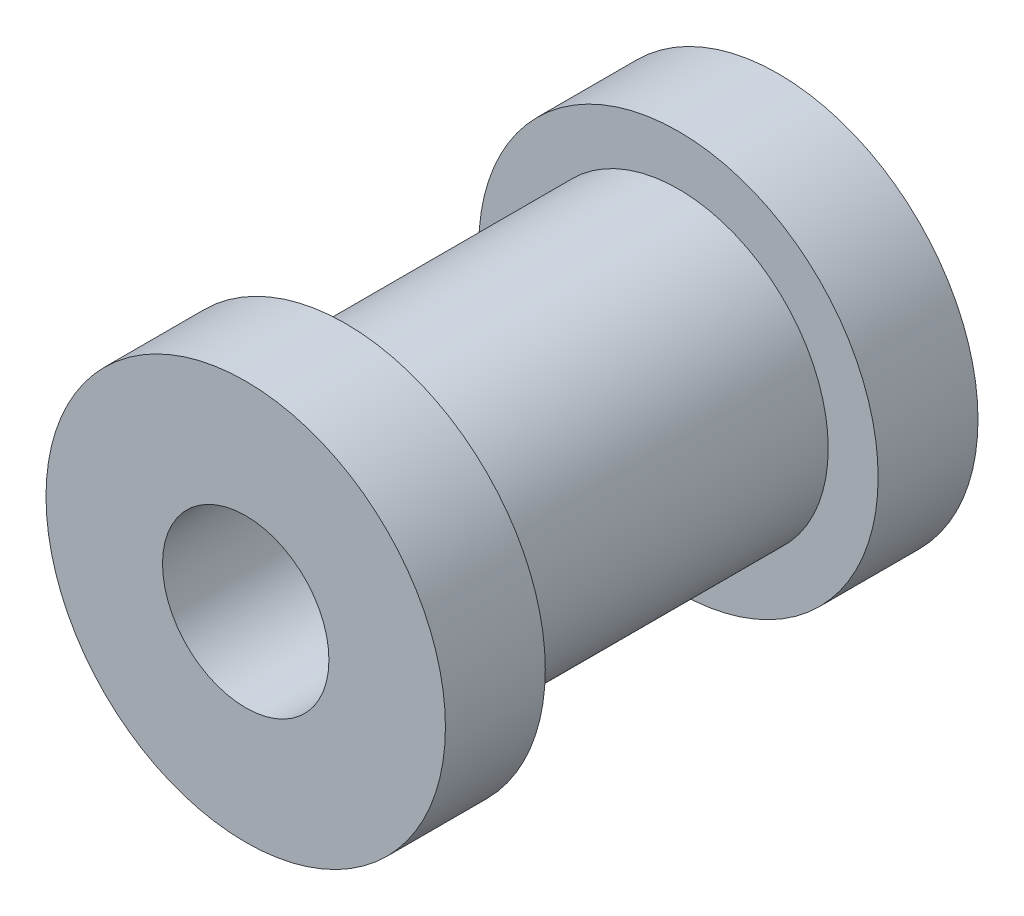
ISO-10303-21;
HEADER;
FILE_DESCRIPTION(('STEP AP214'),'2;1');
FILE_NAME('part.step','',(''),(''),'','','');
FILE_SCHEMA(('AUTOMOTIVE_DESIGN { 1 0 10303 214 1 1 1 1 }'));
ENDSEC;
DATA;
#1=APPLICATION_CONTEXT('core data for automotive mechanical design processes');
#2=APPLICATION_PROTOCOL_DEFINITION('international standard','automotive_design',2000,#1);
#3=PRODUCT_CONTEXT('',#1,'mechanical');
#4=PRODUCT('Part','Part','',(#3));
#5=PRODUCT_RELATED_PRODUCT_CATEGORY('part','',(#4));
#6=PRODUCT_DEFINITION_FORMATION('','',#4);
#7=PRODUCT_DEFINITION_CONTEXT('part definition',#1,'design');
#8=PRODUCT_DEFINITION('design','',#6,#7);
#9=PRODUCT_DEFINITION_SHAPE('','',#8);
#10=(LENGTH_UNIT() NAMED_UNIT(*) SI_UNIT(.MILLI.,.METRE.));
#11=(NAMED_UNIT(*) PLANE_ANGLE_UNIT() SI_UNIT($,.RADIAN.));
#12=(NAMED_UNIT(*) SI_UNIT($,.STERADIAN.) SOLID_ANGLE_UNIT());
#13=UNCERTAINTY_MEASURE_WITH_UNIT(LENGTH_MEASURE(1.E-05),#10,'distance_accuracy_value','');
#14=(GEOMETRIC_REPRESENTATION_CONTEXT(3) GLOBAL_UNCERTAINTY_ASSIGNED_CONTEXT((#13)) GLOBAL_UNIT_ASSIGNED_CONTEXT((#10,
#11,#12)) REPRESENTATION_CONTEXT('',''));
#15=CARTESIAN_POINT('',(0.,0.,0.));
#16=DIRECTION('',(0.,0.,1.));
#17=DIRECTION('',(1.,0.,0.));
#18=AXIS2_PLACEMENT_3D('',#15,#16,#17);
#19=CARTESIAN_POINT('',(0.,0.,16.));
#20=DIRECTION('',(0.,0.,-1.));
#21=DIRECTION('',(-1.,0.,0.));
#22=AXIS2_PLACEMENT_3D('',#19,#20,#21);
#23=CYLINDRICAL_SURFACE('',#22,6.);
#24=CARTESIAN_POINT('',(0.,0.,0.));
#25=DIRECTION('',(0.,0.,1.));
#26=DIRECTION('',(1.,0.,0.));
#27=AXIS2_PLACEMENT_3D('',#24,#25,#26);
#28=CIRCLE('',#27,6.);
#29=CARTESIAN_POINT('',(6.,0.,0.));
#30=VERTEX_POINT('',#29);
#31=EDGE_CURVE('E32',#30,#30,#28,.T.);
#32=ORIENTED_EDGE('',*,*,#31,.T.);
#33=EDGE_LOOP('',(#32));
#34=FACE_BOUND('',#33,.T.);
#35=CARTESIAN_POINT('',(0.,0.,3.));
#36=DIRECTION('',(0.,0.,1.));
#37=DIRECTION('',(1.,0.,0.));
#38=AXIS2_PLACEMENT_3D('',#35,#36,#37);
#39=CIRCLE('',#38,6.);
#40=CARTESIAN_POINT('',(6.,0.,3.));
#41=VERTEX_POINT('',#40);
#42=EDGE_CURVE('E44',#41,#41,#39,.T.);
#43=ORIENTED_EDGE('',*,*,#42,.F.);
#44=EDGE_LOOP('',(#43));
#45=FACE_BOUND('',#44,.T.);
#46=ADVANCED_FACE('F28',(#34,#45),#23,.T.);
#47=CARTESIAN_POINT('',(0.,0.,16.));
#48=DIRECTION('',(0.,0.,1.));
#49=DIRECTION('',(1.,0.,0.));
#50=AXIS2_PLACEMENT_3D('',#47,#48,#49);
#51=PLANE('',#50);
#52=CARTESIAN_POINT('',(0.,0.,16.));
#53=DIRECTION('',(0.,0.,1.));
#54=DIRECTION('',(1.,0.,0.));
#55=AXIS2_PLACEMENT_3D('',#52,#53,#54);
#56=CIRCLE('',#55,6.);
#57=CARTESIAN_POINT('',(6.,0.,16.));
#58=VERTEX_POINT('',#57);
#59=EDGE_CURVE('E10',#58,#58,#56,.T.);
#60=ORIENTED_EDGE('',*,*,#59,.T.);
#61=EDGE_LOOP('',(#60));
#62=FACE_BOUND('',#61,.T.);
#63=CARTESIAN_POINT('',(0.,0.,16.));
#64=DIRECTION('',(0.,0.,1.));
#65=DIRECTION('',(1.,0.,0.));
#66=AXIS2_PLACEMENT_3D('',#63,#64,#65);
#67=CIRCLE('',#66,2.5);
#68=CARTESIAN_POINT('',(2.5,0.,16.));
#69=VERTEX_POINT('',#68);
#70=EDGE_CURVE('E39',#69,#69,#67,.T.);
#71=ORIENTED_EDGE('',*,*,#70,.F.);
#72=EDGE_LOOP('',(#71));
#73=FACE_BOUND('',#72,.T.);
#74=ADVANCED_FACE('F71',(#62,#73),#51,.T.);
#75=CARTESIAN_POINT('',(0.,0.,0.));
#76=DIRECTION('',(0.,0.,1.));
#77=DIRECTION('',(1.,0.,0.));
#78=AXIS2_PLACEMENT_3D('',#75,#76,#77);
#79=PLANE('',#78);
#80=ORIENTED_EDGE('',*,*,#31,.F.);
#81=EDGE_LOOP('',(#80));
#82=FACE_BOUND('',#81,.T.);
#83=CARTESIAN_POINT('',(0.,0.,0.));
#84=DIRECTION('',(0.,0.,1.));
#85=DIRECTION('',(1.,0.,0.));
#86=AXIS2_PLACEMENT_3D('',#83,#84,#85);
#87=CIRCLE('',#86,2.5);
#88=CARTESIAN_POINT('',(2.5,0.,0.));
#89=VERTEX_POINT('',#88);
#90=EDGE_CURVE('E41',#89,#89,#87,.T.);
#91=ORIENTED_EDGE('',*,*,#90,.T.);
#92=EDGE_LOOP('',(#91));
#93=FACE_BOUND('',#92,.T.);
#94=ADVANCED_FACE('F76',(#82,#93),#79,.F.);
#95=CARTESIAN_POINT('',(0.,0.,13.));
#96=DIRECTION('',(0.,0.,1.));
#97=DIRECTION('',(1.,0.,0.));
#98=AXIS2_PLACEMENT_3D('',#95,#96,#97);
#99=CIRCLE('',#98,6.);
#100=CARTESIAN_POINT('',(6.,0.,13.));
#101=VERTEX_POINT('',#100);
#102=EDGE_CURVE('E47',#101,#101,#99,.T.);
#103=ORIENTED_EDGE('',*,*,#102,.T.);
#104=EDGE_LOOP('',(#103));
#105=FACE_BOUND('',#104,.T.);
#106=ORIENTED_EDGE('',*,*,#59,.F.);
#107=EDGE_LOOP('',(#106));
#108=FACE_BOUND('',#107,.T.);
#109=ADVANCED_FACE('F30',(#105,#108),#23,.T.);
#110=CARTESIAN_POINT('',(0.,0.,16.));
#111=DIRECTION('',(0.,0.,-1.));
#112=DIRECTION('',(-1.,0.,0.));
#113=AXIS2_PLACEMENT_3D('',#110,#111,#112);
#114=CYLINDRICAL_SURFACE('',#113,2.5);
#115=ORIENTED_EDGE('',*,*,#70,.T.);
#116=EDGE_LOOP('',(#115));
#117=FACE_BOUND('',#116,.T.);
#118=ORIENTED_EDGE('',*,*,#90,.F.);
#119=EDGE_LOOP('',(#118));
#120=FACE_BOUND('',#119,.T.);
#121=ADVANCED_FACE('F66',(#117,#120),#114,.F.);
#122=CARTESIAN_POINT('',(0.,0.,3.));
#123=DIRECTION('',(0.,0.,1.));
#124=DIRECTION('',(1.,0.,0.));
#125=AXIS2_PLACEMENT_3D('',#122,#123,#124);
#126=PLANE('',#125);
#127=CARTESIAN_POINT('',(0.,0.,3.));
#128=DIRECTION('',(0.,0.,1.));
#129=DIRECTION('',(1.,0.,0.));
#130=AXIS2_PLACEMENT_3D('',#127,#128,#129);
#131=CIRCLE('',#130,4.5);
#132=CARTESIAN_POINT('',(4.5,0.,3.));
#133=VERTEX_POINT('',#132);
#134=EDGE_CURVE('E50',#133,#133,#131,.T.);
#135=ORIENTED_EDGE('',*,*,#134,.F.);
#136=EDGE_LOOP('',(#135));
#137=FACE_BOUND('',#136,.T.);
#138=ORIENTED_EDGE('',*,*,#42,.T.);
#139=EDGE_LOOP('',(#138));
#140=FACE_BOUND('',#139,.T.);
#141=ADVANCED_FACE('F62',(#137,#140),#126,.T.);
#142=CARTESIAN_POINT('',(0.,0.,13.));
#143=DIRECTION('',(0.,0.,1.));
#144=DIRECTION('',(1.,0.,0.));
#145=AXIS2_PLACEMENT_3D('',#142,#143,#144);
#146=PLANE('',#145);
#147=CARTESIAN_POINT('',(0.,0.,13.));
#148=DIRECTION('',(0.,0.,1.));
#149=DIRECTION('',(1.,0.,0.));
#150=AXIS2_PLACEMENT_3D('',#147,#148,#149);
#151=CIRCLE('',#150,4.5);
#152=CARTESIAN_POINT('',(4.5,0.,13.));
#153=VERTEX_POINT('',#152);
#154=EDGE_CURVE('E53',#153,#153,#151,.T.);
#155=ORIENTED_EDGE('',*,*,#154,.T.);
#156=EDGE_LOOP('',(#155));
#157=FACE_BOUND('',#156,.T.);
#158=ORIENTED_EDGE('',*,*,#102,.F.);
#159=EDGE_LOOP('',(#158));
#160=FACE_BOUND('',#159,.T.);
#161=ADVANCED_FACE('F65',(#157,#160),#146,.F.);
#162=CARTESIAN_POINT('',(0.,0.,3.));
#163=DIRECTION('',(0.,0.,1.));
#164=DIRECTION('',(1.,0.,0.));
#165=AXIS2_PLACEMENT_3D('',#162,#163,#164);
#166=CYLINDRICAL_SURFACE('',#165,4.5);
#167=ORIENTED_EDGE('',*,*,#134,.T.);
#168=EDGE_LOOP('',(#167));
#169=FACE_BOUND('',#168,.T.);
#170=ORIENTED_EDGE('',*,*,#154,.F.);
#171=EDGE_LOOP('',(#170));
#172=FACE_BOUND('',#171,.T.);
#173=ADVANCED_FACE('F59',(#169,#172),#166,.T.);
#174=CLOSED_SHELL('',(#46,#74,#94,#109,#121,#141,#161,#173));
#175=MANIFOLD_SOLID_BREP('B2',#174);
#176=ADVANCED_BREP_SHAPE_REPRESENTATION('',(#18,#175),#14);
#177=SHAPE_DEFINITION_REPRESENTATION(#9,#176);
ENDSEC;
END-ISO-10303-21;
